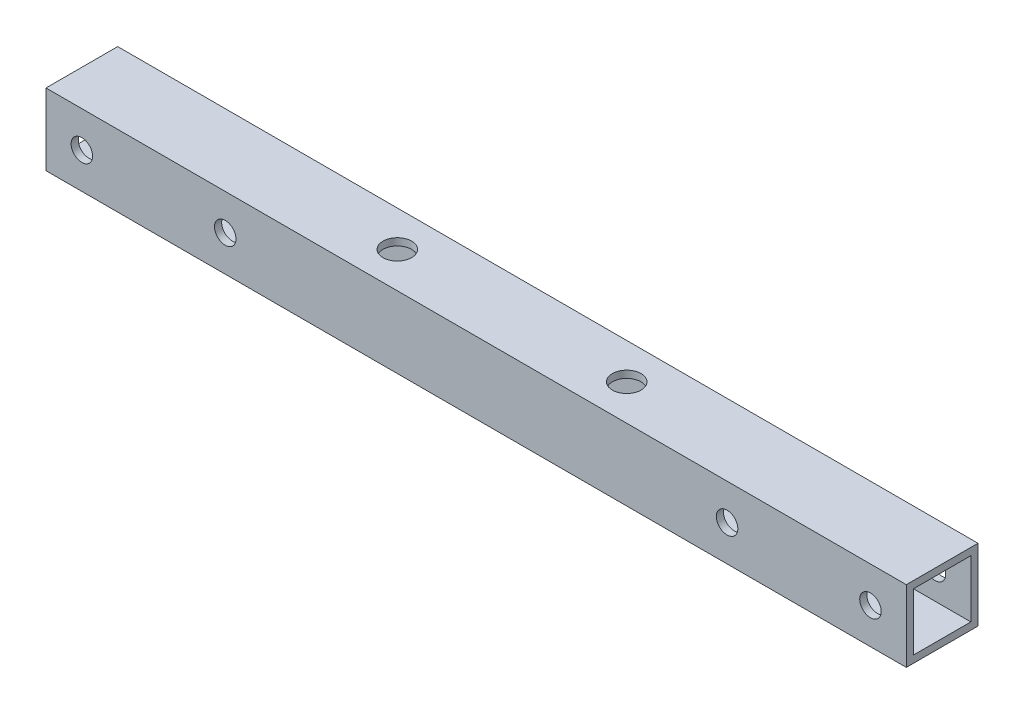
ISO-10303-21;
HEADER;
FILE_DESCRIPTION(('STEP AP214'),'2;1');
FILE_NAME('part.step','',(''),(''),'','','');
FILE_SCHEMA(('AUTOMOTIVE_DESIGN { 1 0 10303 214 1 1 1 1 }'));
ENDSEC;
DATA;
#1=APPLICATION_CONTEXT('core data for automotive mechanical design processes');
#2=APPLICATION_PROTOCOL_DEFINITION('international standard','automotive_design',2000,#1);
#3=PRODUCT_CONTEXT('',#1,'mechanical');
#4=PRODUCT('Part','Part','',(#3));
#5=PRODUCT_RELATED_PRODUCT_CATEGORY('part','',(#4));
#6=PRODUCT_DEFINITION_FORMATION('','',#4);
#7=PRODUCT_DEFINITION_CONTEXT('part definition',#1,'design');
#8=PRODUCT_DEFINITION('design','',#6,#7);
#9=PRODUCT_DEFINITION_SHAPE('','',#8);
#10=(LENGTH_UNIT() NAMED_UNIT(*) SI_UNIT(.MILLI.,.METRE.));
#11=(NAMED_UNIT(*) PLANE_ANGLE_UNIT() SI_UNIT($,.RADIAN.));
#12=(NAMED_UNIT(*) SI_UNIT($,.STERADIAN.) SOLID_ANGLE_UNIT());
#13=UNCERTAINTY_MEASURE_WITH_UNIT(LENGTH_MEASURE(1.E-05),#10,'distance_accuracy_value','');
#14=(GEOMETRIC_REPRESENTATION_CONTEXT(3) GLOBAL_UNCERTAINTY_ASSIGNED_CONTEXT((#13)) GLOBAL_UNIT_ASSIGNED_CONTEXT((#10,
#11,#12)) REPRESENTATION_CONTEXT('',''));
#15=CARTESIAN_POINT('',(0.,0.,0.));
#16=DIRECTION('',(0.,0.,1.));
#17=DIRECTION('',(1.,0.,0.));
#18=AXIS2_PLACEMENT_3D('',#15,#16,#17);
#19=CARTESIAN_POINT('',(120.,0.,0.));
#20=DIRECTION('',(1.,0.,0.));
#21=DIRECTION('',(0.,0.,-1.));
#22=AXIS2_PLACEMENT_3D('',#19,#20,#21);
#23=PLANE('',#22);
#24=DIRECTION('',(0.,1.,0.));
#25=VECTOR('',#24,1.);
#26=CARTESIAN_POINT('',(120.,-5.,-5.));
#27=LINE('',#26,#25);
#28=CARTESIAN_POINT('',(120.,-5.,-5.));
#29=VERTEX_POINT('',#28);
#30=CARTESIAN_POINT('',(120.,5.,-5.));
#31=VERTEX_POINT('',#30);
#32=EDGE_CURVE('E162',#29,#31,#27,.T.);
#33=ORIENTED_EDGE('',*,*,#32,.T.);
#34=DIRECTION('',(0.,0.,1.));
#35=VECTOR('',#34,1.);
#36=CARTESIAN_POINT('',(120.,5.,5.));
#37=LINE('',#36,#35);
#38=CARTESIAN_POINT('',(120.,5.,5.));
#39=VERTEX_POINT('',#38);
#40=EDGE_CURVE('E165',#31,#39,#37,.T.);
#41=ORIENTED_EDGE('',*,*,#40,.T.);
#42=DIRECTION('',(0.,-1.,0.));
#43=VECTOR('',#42,1.);
#44=CARTESIAN_POINT('',(120.,-5.,5.));
#45=LINE('',#44,#43);
#46=CARTESIAN_POINT('',(120.,-5.,5.));
#47=VERTEX_POINT('',#46);
#48=EDGE_CURVE('E168',#39,#47,#45,.T.);
#49=ORIENTED_EDGE('',*,*,#48,.T.);
#50=DIRECTION('',(0.,0.,-1.));
#51=VECTOR('',#50,1.);
#52=CARTESIAN_POINT('',(120.,-5.,5.));
#53=LINE('',#52,#51);
#54=EDGE_CURVE('E170',#47,#29,#53,.T.);
#55=ORIENTED_EDGE('',*,*,#54,.T.);
#56=EDGE_LOOP('',(#33,#41,#49,#55));
#57=FACE_BOUND('',#56,.T.);
#58=DIRECTION('',(0.,0.,1.));
#59=VECTOR('',#58,1.);
#60=CARTESIAN_POINT('',(120.,4.,0.));
#61=LINE('',#60,#59);
#62=CARTESIAN_POINT('',(120.,4.,-4.));
#63=VERTEX_POINT('',#62);
#64=CARTESIAN_POINT('',(120.,4.,4.));
#65=VERTEX_POINT('',#64);
#66=EDGE_CURVE('E132',#63,#65,#61,.T.);
#67=ORIENTED_EDGE('',*,*,#66,.F.);
#68=DIRECTION('',(0.,1.,0.));
#69=VECTOR('',#68,1.);
#70=CARTESIAN_POINT('',(120.,0.,-4.));
#71=LINE('',#70,#69);
#72=CARTESIAN_POINT('',(120.,-4.,-4.));
#73=VERTEX_POINT('',#72);
#74=EDGE_CURVE('E124',#73,#63,#71,.T.);
#75=ORIENTED_EDGE('',*,*,#74,.F.);
#76=DIRECTION('',(0.,0.,-1.));
#77=VECTOR('',#76,1.);
#78=CARTESIAN_POINT('',(120.,-4.,0.));
#79=LINE('',#78,#77);
#80=CARTESIAN_POINT('',(120.,-4.,4.));
#81=VERTEX_POINT('',#80);
#82=EDGE_CURVE('E146',#81,#73,#79,.T.);
#83=ORIENTED_EDGE('',*,*,#82,.F.);
#84=DIRECTION('',(0.,-1.,0.));
#85=VECTOR('',#84,1.);
#86=CARTESIAN_POINT('',(120.,0.,4.));
#87=LINE('',#86,#85);
#88=EDGE_CURVE('E144',#65,#81,#87,.T.);
#89=ORIENTED_EDGE('',*,*,#88,.F.);
#90=EDGE_LOOP('',(#67,#75,#83,#89));
#91=FACE_BOUND('',#90,.T.);
#92=ADVANCED_FACE('F57',(#57,#91),#23,.T.);
#93=CARTESIAN_POINT('',(0.,0.,0.));
#94=DIRECTION('',(1.,0.,0.));
#95=DIRECTION('',(0.,0.,-1.));
#96=AXIS2_PLACEMENT_3D('',#93,#94,#95);
#97=PLANE('',#96);
#98=DIRECTION('',(0.,1.,0.));
#99=VECTOR('',#98,1.);
#100=CARTESIAN_POINT('',(0.,-5.,-5.));
#101=LINE('',#100,#99);
#102=CARTESIAN_POINT('',(0.,-5.,-5.));
#103=VERTEX_POINT('',#102);
#104=CARTESIAN_POINT('',(0.,5.,-5.));
#105=VERTEX_POINT('',#104);
#106=EDGE_CURVE('E140',#103,#105,#101,.T.);
#107=ORIENTED_EDGE('',*,*,#106,.F.);
#108=DIRECTION('',(0.,0.,-1.));
#109=VECTOR('',#108,1.);
#110=CARTESIAN_POINT('',(0.,-5.,5.));
#111=LINE('',#110,#109);
#112=CARTESIAN_POINT('',(0.,-5.,5.));
#113=VERTEX_POINT('',#112);
#114=EDGE_CURVE('E166',#113,#103,#111,.T.);
#115=ORIENTED_EDGE('',*,*,#114,.F.);
#116=DIRECTION('',(0.,-1.,0.));
#117=VECTOR('',#116,1.);
#118=CARTESIAN_POINT('',(0.,-5.,5.));
#119=LINE('',#118,#117);
#120=CARTESIAN_POINT('',(0.,5.,5.));
#121=VERTEX_POINT('',#120);
#122=EDGE_CURVE('E177',#121,#113,#119,.T.);
#123=ORIENTED_EDGE('',*,*,#122,.F.);
#124=DIRECTION('',(0.,0.,1.));
#125=VECTOR('',#124,1.);
#126=CARTESIAN_POINT('',(0.,5.,5.));
#127=LINE('',#126,#125);
#128=EDGE_CURVE('E175',#105,#121,#127,.T.);
#129=ORIENTED_EDGE('',*,*,#128,.F.);
#130=EDGE_LOOP('',(#107,#115,#123,#129));
#131=FACE_BOUND('',#130,.T.);
#132=DIRECTION('',(0.,1.,0.));
#133=VECTOR('',#132,1.);
#134=CARTESIAN_POINT('',(0.,0.,-4.));
#135=LINE('',#134,#133);
#136=CARTESIAN_POINT('',(0.,-4.,-4.));
#137=VERTEX_POINT('',#136);
#138=CARTESIAN_POINT('',(0.,4.,-4.));
#139=VERTEX_POINT('',#138);
#140=EDGE_CURVE('E82',#137,#139,#135,.T.);
#141=ORIENTED_EDGE('',*,*,#140,.T.);
#142=DIRECTION('',(0.,0.,1.));
#143=VECTOR('',#142,1.);
#144=CARTESIAN_POINT('',(0.,4.,0.));
#145=LINE('',#144,#143);
#146=CARTESIAN_POINT('',(0.,4.,4.));
#147=VERTEX_POINT('',#146);
#148=EDGE_CURVE('E139',#139,#147,#145,.T.);
#149=ORIENTED_EDGE('',*,*,#148,.T.);
#150=DIRECTION('',(0.,-1.,0.));
#151=VECTOR('',#150,1.);
#152=CARTESIAN_POINT('',(0.,0.,4.));
#153=LINE('',#152,#151);
#154=CARTESIAN_POINT('',(0.,-4.,4.));
#155=VERTEX_POINT('',#154);
#156=EDGE_CURVE('E154',#147,#155,#153,.T.);
#157=ORIENTED_EDGE('',*,*,#156,.T.);
#158=DIRECTION('',(0.,0.,-1.));
#159=VECTOR('',#158,1.);
#160=CARTESIAN_POINT('',(0.,-4.,0.));
#161=LINE('',#160,#159);
#162=EDGE_CURVE('E133',#155,#137,#161,.T.);
#163=ORIENTED_EDGE('',*,*,#162,.T.);
#164=EDGE_LOOP('',(#141,#149,#157,#163));
#165=FACE_BOUND('',#164,.T.);
#166=ADVANCED_FACE('F266',(#131,#165),#97,.F.);
#167=CARTESIAN_POINT('',(120.,-5.,-5.));
#168=DIRECTION('',(0.,0.,1.));
#169=DIRECTION('',(1.,0.,0.));
#170=AXIS2_PLACEMENT_3D('',#167,#168,#169);
#171=PLANE('',#170);
#172=CARTESIAN_POINT('',(5.,0.,-5.));
#173=DIRECTION('',(0.,0.,1.));
#174=DIRECTION('',(1.,0.,0.));
#175=AXIS2_PLACEMENT_3D('',#172,#173,#174);
#176=CIRCLE('',#175,1.5);
#177=CARTESIAN_POINT('',(6.5,0.,-5.));
#178=VERTEX_POINT('',#177);
#179=EDGE_CURVE('E199',#178,#178,#176,.T.);
#180=ORIENTED_EDGE('',*,*,#179,.T.);
#181=EDGE_LOOP('',(#180));
#182=FACE_BOUND('',#181,.T.);
#183=CARTESIAN_POINT('',(95.,0.,-5.));
#184=DIRECTION('',(0.,0.,1.));
#185=DIRECTION('',(-1.,0.,0.));
#186=AXIS2_PLACEMENT_3D('',#183,#184,#185);
#187=CIRCLE('',#186,1.5);
#188=CARTESIAN_POINT('',(93.5,0.,-5.));
#189=VERTEX_POINT('',#188);
#190=EDGE_CURVE('E314',#189,#189,#187,.T.);
#191=ORIENTED_EDGE('',*,*,#190,.T.);
#192=EDGE_LOOP('',(#191));
#193=FACE_BOUND('',#192,.T.);
#194=CARTESIAN_POINT('',(115.,0.,-5.));
#195=DIRECTION('',(0.,0.,1.));
#196=DIRECTION('',(-1.,0.,0.));
#197=AXIS2_PLACEMENT_3D('',#194,#195,#196);
#198=CIRCLE('',#197,1.5);
#199=CARTESIAN_POINT('',(113.5,0.,-5.));
#200=VERTEX_POINT('',#199);
#201=EDGE_CURVE('E307',#200,#200,#198,.T.);
#202=ORIENTED_EDGE('',*,*,#201,.T.);
#203=EDGE_LOOP('',(#202));
#204=FACE_BOUND('',#203,.T.);
#205=CARTESIAN_POINT('',(25.,0.,-5.));
#206=DIRECTION('',(0.,0.,1.));
#207=DIRECTION('',(1.,0.,0.));
#208=AXIS2_PLACEMENT_3D('',#205,#206,#207);
#209=CIRCLE('',#208,1.5);
#210=CARTESIAN_POINT('',(26.5,0.,-5.));
#211=VERTEX_POINT('',#210);
#212=EDGE_CURVE('E306',#211,#211,#209,.T.);
#213=ORIENTED_EDGE('',*,*,#212,.T.);
#214=EDGE_LOOP('',(#213));
#215=FACE_BOUND('',#214,.T.);
#216=ORIENTED_EDGE('',*,*,#106,.T.);
#217=DIRECTION('',(-1.,0.,0.));
#218=VECTOR('',#217,1.);
#219=CARTESIAN_POINT('',(120.,5.,-5.));
#220=LINE('',#219,#218);
#221=EDGE_CURVE('E12',#31,#105,#220,.T.);
#222=ORIENTED_EDGE('',*,*,#221,.F.);
#223=ORIENTED_EDGE('',*,*,#32,.F.);
#224=DIRECTION('',(-1.,0.,0.));
#225=VECTOR('',#224,1.);
#226=CARTESIAN_POINT('',(120.,-5.,-5.));
#227=LINE('',#226,#225);
#228=EDGE_CURVE('E172',#29,#103,#227,.T.);
#229=ORIENTED_EDGE('',*,*,#228,.T.);
#230=EDGE_LOOP('',(#216,#222,#223,#229));
#231=FACE_BOUND('',#230,.T.);
#232=ADVANCED_FACE('F59',(#182,#193,#204,#215,#231),#171,.F.);
#233=CARTESIAN_POINT('',(120.,5.,5.));
#234=DIRECTION('',(0.,-1.,0.));
#235=DIRECTION('',(0.,0.,-1.));
#236=AXIS2_PLACEMENT_3D('',#233,#234,#235);
#237=PLANE('',#236);
#238=CARTESIAN_POINT('',(44.,5.,0.));
#239=DIRECTION('',(0.,1.,0.));
#240=DIRECTION('',(0.,0.,1.));
#241=AXIS2_PLACEMENT_3D('',#238,#239,#240);
#242=CIRCLE('',#241,2.);
#243=CARTESIAN_POINT('',(44.,5.,2.));
#244=VERTEX_POINT('',#243);
#245=EDGE_CURVE('E223',#244,#244,#242,.T.);
#246=ORIENTED_EDGE('',*,*,#245,.F.);
#247=EDGE_LOOP('',(#246));
#248=FACE_BOUND('',#247,.T.);
#249=CARTESIAN_POINT('',(76.,5.,0.));
#250=DIRECTION('',(0.,1.,0.));
#251=DIRECTION('',(0.,0.,-1.));
#252=AXIS2_PLACEMENT_3D('',#249,#250,#251);
#253=CIRCLE('',#252,2.);
#254=CARTESIAN_POINT('',(76.,5.,-2.));
#255=VERTEX_POINT('',#254);
#256=EDGE_CURVE('E220',#255,#255,#253,.T.);
#257=ORIENTED_EDGE('',*,*,#256,.F.);
#258=EDGE_LOOP('',(#257));
#259=FACE_BOUND('',#258,.T.);
#260=ORIENTED_EDGE('',*,*,#128,.T.);
#261=DIRECTION('',(-1.,0.,0.));
#262=VECTOR('',#261,1.);
#263=CARTESIAN_POINT('',(120.,5.,5.));
#264=LINE('',#263,#262);
#265=EDGE_CURVE('E66',#39,#121,#264,.T.);
#266=ORIENTED_EDGE('',*,*,#265,.F.);
#267=ORIENTED_EDGE('',*,*,#40,.F.);
#268=ORIENTED_EDGE('',*,*,#221,.T.);
#269=EDGE_LOOP('',(#260,#266,#267,#268));
#270=FACE_BOUND('',#269,.T.);
#271=ADVANCED_FACE('F252',(#248,#259,#270),#237,.F.);
#272=CARTESIAN_POINT('',(120.,-5.,5.));
#273=DIRECTION('',(0.,0.,-1.));
#274=DIRECTION('',(-1.,0.,0.));
#275=AXIS2_PLACEMENT_3D('',#272,#273,#274);
#276=PLANE('',#275);
#277=CARTESIAN_POINT('',(5.,0.,5.));
#278=DIRECTION('',(0.,0.,1.));
#279=DIRECTION('',(1.,0.,0.));
#280=AXIS2_PLACEMENT_3D('',#277,#278,#279);
#281=CIRCLE('',#280,1.5);
#282=CARTESIAN_POINT('',(6.5,0.,5.));
#283=VERTEX_POINT('',#282);
#284=EDGE_CURVE('E293',#283,#283,#281,.T.);
#285=ORIENTED_EDGE('',*,*,#284,.F.);
#286=EDGE_LOOP('',(#285));
#287=FACE_BOUND('',#286,.T.);
#288=CARTESIAN_POINT('',(95.,0.,5.));
#289=DIRECTION('',(0.,0.,1.));
#290=DIRECTION('',(-1.,0.,0.));
#291=AXIS2_PLACEMENT_3D('',#288,#289,#290);
#292=CIRCLE('',#291,1.5);
#293=CARTESIAN_POINT('',(93.5,0.,5.));
#294=VERTEX_POINT('',#293);
#295=EDGE_CURVE('E297',#294,#294,#292,.T.);
#296=ORIENTED_EDGE('',*,*,#295,.F.);
#297=EDGE_LOOP('',(#296));
#298=FACE_BOUND('',#297,.T.);
#299=CARTESIAN_POINT('',(115.,0.,5.));
#300=DIRECTION('',(0.,0.,1.));
#301=DIRECTION('',(-1.,0.,0.));
#302=AXIS2_PLACEMENT_3D('',#299,#300,#301);
#303=CIRCLE('',#302,1.5);
#304=CARTESIAN_POINT('',(113.5,0.,5.));
#305=VERTEX_POINT('',#304);
#306=EDGE_CURVE('E301',#305,#305,#303,.T.);
#307=ORIENTED_EDGE('',*,*,#306,.F.);
#308=EDGE_LOOP('',(#307));
#309=FACE_BOUND('',#308,.T.);
#310=CARTESIAN_POINT('',(25.,0.,5.));
#311=DIRECTION('',(0.,0.,1.));
#312=DIRECTION('',(1.,0.,0.));
#313=AXIS2_PLACEMENT_3D('',#310,#311,#312);
#314=CIRCLE('',#313,1.5);
#315=CARTESIAN_POINT('',(26.5,0.,5.));
#316=VERTEX_POINT('',#315);
#317=EDGE_CURVE('E304',#316,#316,#314,.T.);
#318=ORIENTED_EDGE('',*,*,#317,.F.);
#319=EDGE_LOOP('',(#318));
#320=FACE_BOUND('',#319,.T.);
#321=ORIENTED_EDGE('',*,*,#122,.T.);
#322=DIRECTION('',(-1.,0.,0.));
#323=VECTOR('',#322,1.);
#324=CARTESIAN_POINT('',(120.,-5.,5.));
#325=LINE('',#324,#323);
#326=EDGE_CURVE('E182',#47,#113,#325,.T.);
#327=ORIENTED_EDGE('',*,*,#326,.F.);
#328=ORIENTED_EDGE('',*,*,#48,.F.);
#329=ORIENTED_EDGE('',*,*,#265,.T.);
#330=EDGE_LOOP('',(#321,#327,#328,#329));
#331=FACE_BOUND('',#330,.T.);
#332=ADVANCED_FACE('F255',(#287,#298,#309,#320,#331),#276,.F.);
#333=CARTESIAN_POINT('',(120.,-5.,5.));
#334=DIRECTION('',(0.,1.,0.));
#335=DIRECTION('',(0.,0.,1.));
#336=AXIS2_PLACEMENT_3D('',#333,#334,#335);
#337=PLANE('',#336);
#338=CARTESIAN_POINT('',(44.,-5.,0.));
#339=DIRECTION('',(0.,1.,0.));
#340=DIRECTION('',(0.,0.,1.));
#341=AXIS2_PLACEMENT_3D('',#338,#339,#340);
#342=CIRCLE('',#341,2.);
#343=CARTESIAN_POINT('',(44.,-5.,2.));
#344=VERTEX_POINT('',#343);
#345=EDGE_CURVE('E191',#344,#344,#342,.T.);
#346=ORIENTED_EDGE('',*,*,#345,.T.);
#347=EDGE_LOOP('',(#346));
#348=FACE_BOUND('',#347,.T.);
#349=CARTESIAN_POINT('',(76.,-5.,0.));
#350=DIRECTION('',(0.,1.,0.));
#351=DIRECTION('',(0.,0.,-1.));
#352=AXIS2_PLACEMENT_3D('',#349,#350,#351);
#353=CIRCLE('',#352,2.);
#354=CARTESIAN_POINT('',(76.,-5.,-2.));
#355=VERTEX_POINT('',#354);
#356=EDGE_CURVE('E226',#355,#355,#353,.T.);
#357=ORIENTED_EDGE('',*,*,#356,.T.);
#358=EDGE_LOOP('',(#357));
#359=FACE_BOUND('',#358,.T.);
#360=ORIENTED_EDGE('',*,*,#114,.T.);
#361=ORIENTED_EDGE('',*,*,#228,.F.);
#362=ORIENTED_EDGE('',*,*,#54,.F.);
#363=ORIENTED_EDGE('',*,*,#326,.T.);
#364=EDGE_LOOP('',(#360,#361,#362,#363));
#365=FACE_BOUND('',#364,.T.);
#366=ADVANCED_FACE('F270',(#348,#359,#365),#337,.F.);
#367=CARTESIAN_POINT('',(120.,0.,-4.));
#368=DIRECTION('',(0.,0.,1.));
#369=DIRECTION('',(1.,0.,0.));
#370=AXIS2_PLACEMENT_3D('',#367,#368,#369);
#371=PLANE('',#370);
#372=CARTESIAN_POINT('',(5.,0.,-4.));
#373=DIRECTION('',(0.,0.,1.));
#374=DIRECTION('',(1.,0.,0.));
#375=AXIS2_PLACEMENT_3D('',#372,#373,#374);
#376=CIRCLE('',#375,1.5);
#377=CARTESIAN_POINT('',(6.5,0.,-4.));
#378=VERTEX_POINT('',#377);
#379=EDGE_CURVE('E217',#378,#378,#376,.T.);
#380=ORIENTED_EDGE('',*,*,#379,.F.);
#381=EDGE_LOOP('',(#380));
#382=FACE_BOUND('',#381,.T.);
#383=CARTESIAN_POINT('',(95.,0.,-4.));
#384=DIRECTION('',(0.,0.,1.));
#385=DIRECTION('',(1.,0.,0.));
#386=AXIS2_PLACEMENT_3D('',#383,#384,#385);
#387=CIRCLE('',#386,1.5);
#388=CARTESIAN_POINT('',(96.5,0.,-4.));
#389=VERTEX_POINT('',#388);
#390=EDGE_CURVE('E205',#389,#389,#387,.T.);
#391=ORIENTED_EDGE('',*,*,#390,.F.);
#392=EDGE_LOOP('',(#391));
#393=FACE_BOUND('',#392,.T.);
#394=CARTESIAN_POINT('',(115.,0.,-4.));
#395=DIRECTION('',(0.,0.,1.));
#396=DIRECTION('',(1.,0.,0.));
#397=AXIS2_PLACEMENT_3D('',#394,#395,#396);
#398=CIRCLE('',#397,1.5);
#399=CARTESIAN_POINT('',(116.5,0.,-4.));
#400=VERTEX_POINT('',#399);
#401=EDGE_CURVE('E202',#400,#400,#398,.T.);
#402=ORIENTED_EDGE('',*,*,#401,.F.);
#403=EDGE_LOOP('',(#402));
#404=FACE_BOUND('',#403,.T.);
#405=CARTESIAN_POINT('',(25.,0.,-4.));
#406=DIRECTION('',(0.,0.,1.));
#407=DIRECTION('',(1.,0.,0.));
#408=AXIS2_PLACEMENT_3D('',#405,#406,#407);
#409=CIRCLE('',#408,1.5);
#410=CARTESIAN_POINT('',(26.5,0.,-4.));
#411=VERTEX_POINT('',#410);
#412=EDGE_CURVE('E198',#411,#411,#409,.T.);
#413=ORIENTED_EDGE('',*,*,#412,.F.);
#414=EDGE_LOOP('',(#413));
#415=FACE_BOUND('',#414,.T.);
#416=ORIENTED_EDGE('',*,*,#140,.F.);
#417=DIRECTION('',(-1.,0.,0.));
#418=VECTOR('',#417,1.);
#419=CARTESIAN_POINT('',(120.,-4.,-4.));
#420=LINE('',#419,#418);
#421=EDGE_CURVE('E128',#73,#137,#420,.T.);
#422=ORIENTED_EDGE('',*,*,#421,.F.);
#423=ORIENTED_EDGE('',*,*,#74,.T.);
#424=DIRECTION('',(-1.,0.,0.));
#425=VECTOR('',#424,1.);
#426=CARTESIAN_POINT('',(120.,4.,-4.));
#427=LINE('',#426,#425);
#428=EDGE_CURVE('E127',#63,#139,#427,.T.);
#429=ORIENTED_EDGE('',*,*,#428,.T.);
#430=EDGE_LOOP('',(#416,#422,#423,#429));
#431=FACE_BOUND('',#430,.T.);
#432=ADVANCED_FACE('F126',(#382,#393,#404,#415,#431),#371,.T.);
#433=CARTESIAN_POINT('',(120.,4.,0.));
#434=DIRECTION('',(0.,-1.,0.));
#435=DIRECTION('',(0.,0.,-1.));
#436=AXIS2_PLACEMENT_3D('',#433,#434,#435);
#437=PLANE('',#436);
#438=CARTESIAN_POINT('',(44.,4.,0.));
#439=DIRECTION('',(0.,-1.,0.));
#440=DIRECTION('',(0.,0.,-1.));
#441=AXIS2_PLACEMENT_3D('',#438,#439,#440);
#442=CIRCLE('',#441,2.);
#443=CARTESIAN_POINT('',(44.,4.,-2.));
#444=VERTEX_POINT('',#443);
#445=EDGE_CURVE('E152',#444,#444,#442,.T.);
#446=ORIENTED_EDGE('',*,*,#445,.F.);
#447=EDGE_LOOP('',(#446));
#448=FACE_BOUND('',#447,.T.);
#449=CARTESIAN_POINT('',(76.,4.,0.));
#450=DIRECTION('',(0.,-1.,0.));
#451=DIRECTION('',(0.,0.,-1.));
#452=AXIS2_PLACEMENT_3D('',#449,#450,#451);
#453=CIRCLE('',#452,2.);
#454=CARTESIAN_POINT('',(76.,4.,-2.));
#455=VERTEX_POINT('',#454);
#456=EDGE_CURVE('E190',#455,#455,#453,.T.);
#457=ORIENTED_EDGE('',*,*,#456,.F.);
#458=EDGE_LOOP('',(#457));
#459=FACE_BOUND('',#458,.T.);
#460=ORIENTED_EDGE('',*,*,#148,.F.);
#461=ORIENTED_EDGE('',*,*,#428,.F.);
#462=ORIENTED_EDGE('',*,*,#66,.T.);
#463=DIRECTION('',(-1.,0.,0.));
#464=VECTOR('',#463,1.);
#465=CARTESIAN_POINT('',(120.,4.,4.));
#466=LINE('',#465,#464);
#467=EDGE_CURVE('E141',#65,#147,#466,.T.);
#468=ORIENTED_EDGE('',*,*,#467,.T.);
#469=EDGE_LOOP('',(#460,#461,#462,#468));
#470=FACE_BOUND('',#469,.T.);
#471=ADVANCED_FACE('F136',(#448,#459,#470),#437,.T.);
#472=CARTESIAN_POINT('',(120.,0.,4.));
#473=DIRECTION('',(0.,0.,-1.));
#474=DIRECTION('',(-1.,0.,0.));
#475=AXIS2_PLACEMENT_3D('',#472,#473,#474);
#476=PLANE('',#475);
#477=CARTESIAN_POINT('',(5.,0.,4.));
#478=DIRECTION('',(0.,0.,-1.));
#479=DIRECTION('',(-1.,0.,0.));
#480=AXIS2_PLACEMENT_3D('',#477,#478,#479);
#481=CIRCLE('',#480,1.5);
#482=CARTESIAN_POINT('',(3.5,0.,4.));
#483=VERTEX_POINT('',#482);
#484=EDGE_CURVE('E61',#483,#483,#481,.T.);
#485=ORIENTED_EDGE('',*,*,#484,.F.);
#486=EDGE_LOOP('',(#485));
#487=FACE_BOUND('',#486,.T.);
#488=CARTESIAN_POINT('',(95.,0.,4.));
#489=DIRECTION('',(0.,0.,-1.));
#490=DIRECTION('',(-1.,0.,0.));
#491=AXIS2_PLACEMENT_3D('',#488,#489,#490);
#492=CIRCLE('',#491,1.5);
#493=CARTESIAN_POINT('',(93.5,0.,4.));
#494=VERTEX_POINT('',#493);
#495=EDGE_CURVE('E203',#494,#494,#492,.T.);
#496=ORIENTED_EDGE('',*,*,#495,.F.);
#497=EDGE_LOOP('',(#496));
#498=FACE_BOUND('',#497,.T.);
#499=CARTESIAN_POINT('',(115.,0.,4.));
#500=DIRECTION('',(0.,0.,-1.));
#501=DIRECTION('',(-1.,0.,0.));
#502=AXIS2_PLACEMENT_3D('',#499,#500,#501);
#503=CIRCLE('',#502,1.5);
#504=CARTESIAN_POINT('',(113.5,0.,4.));
#505=VERTEX_POINT('',#504);
#506=EDGE_CURVE('E200',#505,#505,#503,.T.);
#507=ORIENTED_EDGE('',*,*,#506,.F.);
#508=EDGE_LOOP('',(#507));
#509=FACE_BOUND('',#508,.T.);
#510=CARTESIAN_POINT('',(25.,0.,4.));
#511=DIRECTION('',(0.,0.,-1.));
#512=DIRECTION('',(-1.,0.,0.));
#513=AXIS2_PLACEMENT_3D('',#510,#511,#512);
#514=CIRCLE('',#513,1.5);
#515=CARTESIAN_POINT('',(23.5,0.,4.));
#516=VERTEX_POINT('',#515);
#517=EDGE_CURVE('E195',#516,#516,#514,.T.);
#518=ORIENTED_EDGE('',*,*,#517,.F.);
#519=EDGE_LOOP('',(#518));
#520=FACE_BOUND('',#519,.T.);
#521=ORIENTED_EDGE('',*,*,#156,.F.);
#522=ORIENTED_EDGE('',*,*,#467,.F.);
#523=ORIENTED_EDGE('',*,*,#88,.T.);
#524=DIRECTION('',(-1.,0.,0.));
#525=VECTOR('',#524,1.);
#526=CARTESIAN_POINT('',(120.,-4.,4.));
#527=LINE('',#526,#525);
#528=EDGE_CURVE('E74',#81,#155,#527,.T.);
#529=ORIENTED_EDGE('',*,*,#528,.T.);
#530=EDGE_LOOP('',(#521,#522,#523,#529));
#531=FACE_BOUND('',#530,.T.);
#532=ADVANCED_FACE('F240',(#487,#498,#509,#520,#531),#476,.T.);
#533=CARTESIAN_POINT('',(120.,-4.,0.));
#534=DIRECTION('',(0.,1.,0.));
#535=DIRECTION('',(0.,0.,1.));
#536=AXIS2_PLACEMENT_3D('',#533,#534,#535);
#537=PLANE('',#536);
#538=CARTESIAN_POINT('',(44.,-4.,0.));
#539=DIRECTION('',(0.,1.,0.));
#540=DIRECTION('',(0.,0.,1.));
#541=AXIS2_PLACEMENT_3D('',#538,#539,#540);
#542=CIRCLE('',#541,2.);
#543=CARTESIAN_POINT('',(44.,-4.,2.));
#544=VERTEX_POINT('',#543);
#545=EDGE_CURVE('E192',#544,#544,#542,.T.);
#546=ORIENTED_EDGE('',*,*,#545,.F.);
#547=EDGE_LOOP('',(#546));
#548=FACE_BOUND('',#547,.T.);
#549=CARTESIAN_POINT('',(76.,-4.,0.));
#550=DIRECTION('',(0.,1.,0.));
#551=DIRECTION('',(0.,0.,1.));
#552=AXIS2_PLACEMENT_3D('',#549,#550,#551);
#553=CIRCLE('',#552,2.);
#554=CARTESIAN_POINT('',(76.,-4.,1.99999999999999));
#555=VERTEX_POINT('',#554);
#556=EDGE_CURVE('E187',#555,#555,#553,.T.);
#557=ORIENTED_EDGE('',*,*,#556,.F.);
#558=EDGE_LOOP('',(#557));
#559=FACE_BOUND('',#558,.T.);
#560=ORIENTED_EDGE('',*,*,#162,.F.);
#561=ORIENTED_EDGE('',*,*,#528,.F.);
#562=ORIENTED_EDGE('',*,*,#82,.T.);
#563=ORIENTED_EDGE('',*,*,#421,.T.);
#564=EDGE_LOOP('',(#560,#561,#562,#563));
#565=FACE_BOUND('',#564,.T.);
#566=ADVANCED_FACE('F356',(#548,#559,#565),#537,.T.);
#567=CARTESIAN_POINT('',(76.,-5.,0.));
#568=DIRECTION('',(0.,1.,0.));
#569=DIRECTION('',(0.,0.,1.));
#570=AXIS2_PLACEMENT_3D('',#567,#568,#569);
#571=CYLINDRICAL_SURFACE('',#570,2.);
#572=ORIENTED_EDGE('',*,*,#556,.T.);
#573=EDGE_LOOP('',(#572));
#574=FACE_BOUND('',#573,.T.);
#575=ORIENTED_EDGE('',*,*,#356,.F.);
#576=EDGE_LOOP('',(#575));
#577=FACE_BOUND('',#576,.T.);
#578=ADVANCED_FACE('F249',(#574,#577),#571,.F.);
#579=CARTESIAN_POINT('',(44.,-5.,0.));
#580=DIRECTION('',(0.,1.,0.));
#581=DIRECTION('',(0.,0.,1.));
#582=AXIS2_PLACEMENT_3D('',#579,#580,#581);
#583=CYLINDRICAL_SURFACE('',#582,2.);
#584=ORIENTED_EDGE('',*,*,#545,.T.);
#585=EDGE_LOOP('',(#584));
#586=FACE_BOUND('',#585,.T.);
#587=ORIENTED_EDGE('',*,*,#345,.F.);
#588=EDGE_LOOP('',(#587));
#589=FACE_BOUND('',#588,.T.);
#590=ADVANCED_FACE('F247',(#586,#589),#583,.F.);
#591=ORIENTED_EDGE('',*,*,#456,.T.);
#592=EDGE_LOOP('',(#591));
#593=FACE_BOUND('',#592,.T.);
#594=ORIENTED_EDGE('',*,*,#256,.T.);
#595=EDGE_LOOP('',(#594));
#596=FACE_BOUND('',#595,.T.);
#597=ADVANCED_FACE('F244',(#593,#596),#571,.F.);
#598=ORIENTED_EDGE('',*,*,#445,.T.);
#599=EDGE_LOOP('',(#598));
#600=FACE_BOUND('',#599,.T.);
#601=ORIENTED_EDGE('',*,*,#245,.T.);
#602=EDGE_LOOP('',(#601));
#603=FACE_BOUND('',#602,.T.);
#604=ADVANCED_FACE('F235',(#600,#603),#583,.F.);
#605=CARTESIAN_POINT('',(25.,0.,-5.));
#606=DIRECTION('',(0.,0.,1.));
#607=DIRECTION('',(1.,0.,0.));
#608=AXIS2_PLACEMENT_3D('',#605,#606,#607);
#609=CYLINDRICAL_SURFACE('',#608,1.5);
#610=ORIENTED_EDGE('',*,*,#517,.T.);
#611=EDGE_LOOP('',(#610));
#612=FACE_BOUND('',#611,.T.);
#613=ORIENTED_EDGE('',*,*,#317,.T.);
#614=EDGE_LOOP('',(#613));
#615=FACE_BOUND('',#614,.T.);
#616=ADVANCED_FACE('F348',(#612,#615),#609,.F.);
#617=CARTESIAN_POINT('',(115.,0.,-5.));
#618=DIRECTION('',(0.,0.,1.));
#619=DIRECTION('',(1.,0.,0.));
#620=AXIS2_PLACEMENT_3D('',#617,#618,#619);
#621=CYLINDRICAL_SURFACE('',#620,1.5);
#622=ORIENTED_EDGE('',*,*,#506,.T.);
#623=EDGE_LOOP('',(#622));
#624=FACE_BOUND('',#623,.T.);
#625=ORIENTED_EDGE('',*,*,#306,.T.);
#626=EDGE_LOOP('',(#625));
#627=FACE_BOUND('',#626,.T.);
#628=ADVANCED_FACE('F349',(#624,#627),#621,.F.);
#629=CARTESIAN_POINT('',(95.,0.,-5.));
#630=DIRECTION('',(0.,0.,1.));
#631=DIRECTION('',(1.,0.,0.));
#632=AXIS2_PLACEMENT_3D('',#629,#630,#631);
#633=CYLINDRICAL_SURFACE('',#632,1.5);
#634=ORIENTED_EDGE('',*,*,#495,.T.);
#635=EDGE_LOOP('',(#634));
#636=FACE_BOUND('',#635,.T.);
#637=ORIENTED_EDGE('',*,*,#295,.T.);
#638=EDGE_LOOP('',(#637));
#639=FACE_BOUND('',#638,.T.);
#640=ADVANCED_FACE('F338',(#636,#639),#633,.F.);
#641=CARTESIAN_POINT('',(5.,0.,-5.));
#642=DIRECTION('',(0.,0.,1.));
#643=DIRECTION('',(1.,0.,0.));
#644=AXIS2_PLACEMENT_3D('',#641,#642,#643);
#645=CYLINDRICAL_SURFACE('',#644,1.5);
#646=ORIENTED_EDGE('',*,*,#484,.T.);
#647=EDGE_LOOP('',(#646));
#648=FACE_BOUND('',#647,.T.);
#649=ORIENTED_EDGE('',*,*,#284,.T.);
#650=EDGE_LOOP('',(#649));
#651=FACE_BOUND('',#650,.T.);
#652=ADVANCED_FACE('F331',(#648,#651),#645,.F.);
#653=ORIENTED_EDGE('',*,*,#412,.T.);
#654=EDGE_LOOP('',(#653));
#655=FACE_BOUND('',#654,.T.);
#656=ORIENTED_EDGE('',*,*,#212,.F.);
#657=EDGE_LOOP('',(#656));
#658=FACE_BOUND('',#657,.T.);
#659=ADVANCED_FACE('F340',(#655,#658),#609,.F.);
#660=ORIENTED_EDGE('',*,*,#401,.T.);
#661=EDGE_LOOP('',(#660));
#662=FACE_BOUND('',#661,.T.);
#663=ORIENTED_EDGE('',*,*,#201,.F.);
#664=EDGE_LOOP('',(#663));
#665=FACE_BOUND('',#664,.T.);
#666=ADVANCED_FACE('F335',(#662,#665),#621,.F.);
#667=ORIENTED_EDGE('',*,*,#390,.T.);
#668=EDGE_LOOP('',(#667));
#669=FACE_BOUND('',#668,.T.);
#670=ORIENTED_EDGE('',*,*,#190,.F.);
#671=EDGE_LOOP('',(#670));
#672=FACE_BOUND('',#671,.T.);
#673=ADVANCED_FACE('F328',(#669,#672),#633,.F.);
#674=ORIENTED_EDGE('',*,*,#379,.T.);
#675=EDGE_LOOP('',(#674));
#676=FACE_BOUND('',#675,.T.);
#677=ORIENTED_EDGE('',*,*,#179,.F.);
#678=EDGE_LOOP('',(#677));
#679=FACE_BOUND('',#678,.T.);
#680=ADVANCED_FACE('F326',(#676,#679),#645,.F.);
#681=CLOSED_SHELL('',(#92,#166,#232,#271,#332,#366,#432,#471,#532,#566,#578,#590,#597,#604,#616,
#628,#640,#652,#659,#666,#673,#680));
#682=MANIFOLD_SOLID_BREP('B2',#681);
#683=ADVANCED_BREP_SHAPE_REPRESENTATION('',(#18,#682),#14);
#684=SHAPE_DEFINITION_REPRESENTATION(#9,#683);
ENDSEC;
END-ISO-10303-21;
